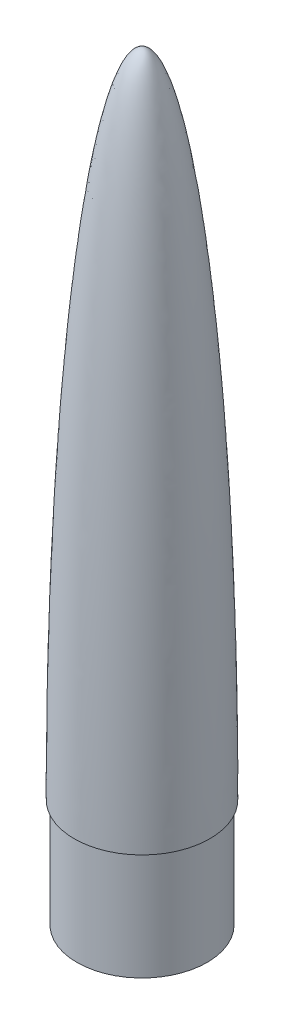
ISO-10303-21;
HEADER;
FILE_DESCRIPTION(('STEP AP214'),'2;1');
FILE_NAME('part.step','',(''),(''),'','','');
FILE_SCHEMA(('AUTOMOTIVE_DESIGN { 1 0 10303 214 1 1 1 1 }'));
ENDSEC;
DATA;
#1=APPLICATION_CONTEXT('core data for automotive mechanical design processes');
#2=APPLICATION_PROTOCOL_DEFINITION('international standard','automotive_design',2000,#1);
#3=PRODUCT_CONTEXT('',#1,'mechanical');
#4=PRODUCT('Part','Part','',(#3));
#5=PRODUCT_RELATED_PRODUCT_CATEGORY('part','',(#4));
#6=PRODUCT_DEFINITION_FORMATION('','',#4);
#7=PRODUCT_DEFINITION_CONTEXT('part definition',#1,'design');
#8=PRODUCT_DEFINITION('design','',#6,#7);
#9=PRODUCT_DEFINITION_SHAPE('','',#8);
#10=(LENGTH_UNIT() NAMED_UNIT(*) SI_UNIT(.MILLI.,.METRE.));
#11=(NAMED_UNIT(*) PLANE_ANGLE_UNIT() SI_UNIT($,.RADIAN.));
#12=(NAMED_UNIT(*) SI_UNIT($,.STERADIAN.) SOLID_ANGLE_UNIT());
#13=UNCERTAINTY_MEASURE_WITH_UNIT(LENGTH_MEASURE(1.E-05),#10,'distance_accuracy_value','');
#14=(GEOMETRIC_REPRESENTATION_CONTEXT(3) GLOBAL_UNCERTAINTY_ASSIGNED_CONTEXT((#13)) GLOBAL_UNIT_ASSIGNED_CONTEXT((#10,
#11,#12)) REPRESENTATION_CONTEXT('',''));
#15=CARTESIAN_POINT('',(0.,0.,0.));
#16=DIRECTION('',(0.,0.,1.));
#17=DIRECTION('',(1.,0.,0.));
#18=AXIS2_PLACEMENT_3D('',#15,#16,#17);
#19=CARTESIAN_POINT('',(0.,0.,0.));
#20=DIRECTION('',(0.,0.,1.));
#21=DIRECTION('',(0.,1.,0.));
#22=AXIS2_PLACEMENT_3D('',#19,#20,#21);
#23=ELLIPSE('',#22,120.,12.5);
#24=TRIMMED_CURVE('',#23,(PARAMETER_VALUE(0.)),(PARAMETER_VALUE(3.14159265358979)),.T.,.PARAMETER.);
#25=CARTESIAN_POINT('',(0.,0.,0.));
#26=DIRECTION('',(0.,-1.,0.));
#27=AXIS1_PLACEMENT('',#25,#26);
#28=SURFACE_OF_REVOLUTION('',#24,#27);
#29=CARTESIAN_POINT('',(0.,0.,0.));
#30=DIRECTION('',(0.,-1.,0.));
#31=DIRECTION('',(0.,0.,-1.));
#32=AXIS2_PLACEMENT_3D('',#29,#30,#31);
#33=CIRCLE('',#32,12.5);
#34=CARTESIAN_POINT('',(0.,0.,-12.5));
#35=VERTEX_POINT('',#34);
#36=EDGE_CURVE('E11',#35,#35,#33,.T.);
#37=ORIENTED_EDGE('',*,*,#36,.F.);
#38=EDGE_LOOP('',(#37));
#39=FACE_BOUND('',#38,.T.);
#40=CARTESIAN_POINT('',(0.,120.,0.));
#41=VERTEX_POINT('',#40);
#42=VERTEX_LOOP('',#41);
#43=FACE_BOUND('',#42,.T.);
#44=ADVANCED_FACE('F33',(#39,#43),#28,.T.);
#45=CARTESIAN_POINT('',(-12.5,0.,0.));
#46=DIRECTION('',(0.,1.,0.));
#47=DIRECTION('',(0.,0.,1.));
#48=AXIS2_PLACEMENT_3D('',#45,#46,#47);
#49=PLANE('',#48);
#50=CARTESIAN_POINT('',(0.,0.,0.));
#51=DIRECTION('',(0.,1.,0.));
#52=DIRECTION('',(0.,0.,1.));
#53=AXIS2_PLACEMENT_3D('',#50,#51,#52);
#54=CIRCLE('',#53,12.);
#55=CARTESIAN_POINT('',(0.,0.,12.));
#56=VERTEX_POINT('',#55);
#57=EDGE_CURVE('E78',#56,#56,#54,.T.);
#58=ORIENTED_EDGE('',*,*,#57,.T.);
#59=EDGE_LOOP('',(#58));
#60=FACE_BOUND('',#59,.T.);
#61=ORIENTED_EDGE('',*,*,#36,.T.);
#62=EDGE_LOOP('',(#61));
#63=FACE_BOUND('',#62,.T.);
#64=ADVANCED_FACE('F66',(#60,#63),#49,.F.);
#65=CARTESIAN_POINT('',(0.,127.,0.));
#66=DIRECTION('',(0.,1.,0.));
#67=DIRECTION('',(0.,0.,1.));
#68=AXIS2_PLACEMENT_3D('',#65,#66,#67);
#69=CYLINDRICAL_SURFACE('',#68,9.5);
#70=CARTESIAN_POINT('',(0.,0.,0.));
#71=DIRECTION('',(0.,1.,0.));
#72=DIRECTION('',(0.,0.,1.));
#73=AXIS2_PLACEMENT_3D('',#70,#71,#72);
#74=CIRCLE('',#73,9.5);
#75=CARTESIAN_POINT('',(0.,0.,9.5));
#76=VERTEX_POINT('',#75);
#77=EDGE_CURVE('E41',#76,#76,#74,.T.);
#78=ORIENTED_EDGE('',*,*,#77,.T.);
#79=EDGE_LOOP('',(#78));
#80=FACE_BOUND('',#79,.T.);
#81=CARTESIAN_POINT('',(0.,-20.,0.));
#82=DIRECTION('',(0.,1.,0.));
#83=DIRECTION('',(0.,0.,1.));
#84=AXIS2_PLACEMENT_3D('',#81,#82,#83);
#85=CIRCLE('',#84,9.5);
#86=CARTESIAN_POINT('',(0.,-20.,9.5));
#87=VERTEX_POINT('',#86);
#88=EDGE_CURVE('E55',#87,#87,#85,.T.);
#89=ORIENTED_EDGE('',*,*,#88,.F.);
#90=EDGE_LOOP('',(#89));
#91=FACE_BOUND('',#90,.T.);
#92=ADVANCED_FACE('F64',(#80,#91),#69,.F.);
#93=CARTESIAN_POINT('',(-9.5,-20.,0.));
#94=DIRECTION('',(0.,-1.,0.));
#95=DIRECTION('',(0.,0.,-1.));
#96=AXIS2_PLACEMENT_3D('',#93,#94,#95);
#97=PLANE('',#96);
#98=ORIENTED_EDGE('',*,*,#88,.T.);
#99=EDGE_LOOP('',(#98));
#100=FACE_BOUND('',#99,.T.);
#101=CARTESIAN_POINT('',(0.,-20.,0.));
#102=DIRECTION('',(0.,1.,0.));
#103=DIRECTION('',(0.,0.,1.));
#104=AXIS2_PLACEMENT_3D('',#101,#102,#103);
#105=CIRCLE('',#104,12.);
#106=CARTESIAN_POINT('',(0.,-20.,12.));
#107=VERTEX_POINT('',#106);
#108=EDGE_CURVE('E58',#107,#107,#105,.T.);
#109=ORIENTED_EDGE('',*,*,#108,.F.);
#110=EDGE_LOOP('',(#109));
#111=FACE_BOUND('',#110,.T.);
#112=ADVANCED_FACE('F73',(#100,#111),#97,.T.);
#113=CARTESIAN_POINT('',(0.,127.,0.));
#114=DIRECTION('',(0.,1.,0.));
#115=DIRECTION('',(0.,0.,1.));
#116=AXIS2_PLACEMENT_3D('',#113,#114,#115);
#117=CYLINDRICAL_SURFACE('',#116,12.);
#118=ORIENTED_EDGE('',*,*,#108,.T.);
#119=EDGE_LOOP('',(#118));
#120=FACE_BOUND('',#119,.T.);
#121=ORIENTED_EDGE('',*,*,#57,.F.);
#122=EDGE_LOOP('',(#121));
#123=FACE_BOUND('',#122,.T.);
#124=ADVANCED_FACE('F50',(#120,#123),#117,.T.);
#125=CARTESIAN_POINT('',(0.,0.,0.));
#126=DIRECTION('',(0.,0.,-1.));
#127=DIRECTION('',(0.,1.,0.));
#128=AXIS2_PLACEMENT_3D('',#125,#126,#127);
#129=ELLIPSE('',#128,117.,9.5);
#130=TRIMMED_CURVE('',#129,(PARAMETER_VALUE(3.14159265358979)),
(PARAMETER_VALUE(6.28318530717959)),.T.,.PARAMETER.);
#131=CARTESIAN_POINT('',(0.,0.,0.));
#132=DIRECTION('',(0.,-1.,0.));
#133=AXIS1_PLACEMENT('',#131,#132);
#134=SURFACE_OF_REVOLUTION('',#130,#133);
#135=CARTESIAN_POINT('',(0.,117.,0.));
#136=VERTEX_POINT('',#135);
#137=VERTEX_LOOP('',#136);
#138=FACE_BOUND('',#137,.T.);
#139=ORIENTED_EDGE('',*,*,#77,.F.);
#140=EDGE_LOOP('',(#139));
#141=FACE_BOUND('',#140,.T.);
#142=ADVANCED_FACE('F47',(#138,#141),#134,.T.);
#143=CLOSED_SHELL('',(#44,#64,#92,#112,#124,#142));
#144=MANIFOLD_SOLID_BREP('B2',#143);
#145=ADVANCED_BREP_SHAPE_REPRESENTATION('',(#18,#144),#14);
#146=SHAPE_DEFINITION_REPRESENTATION(#9,#145);
ENDSEC;
END-ISO-10303-21;
